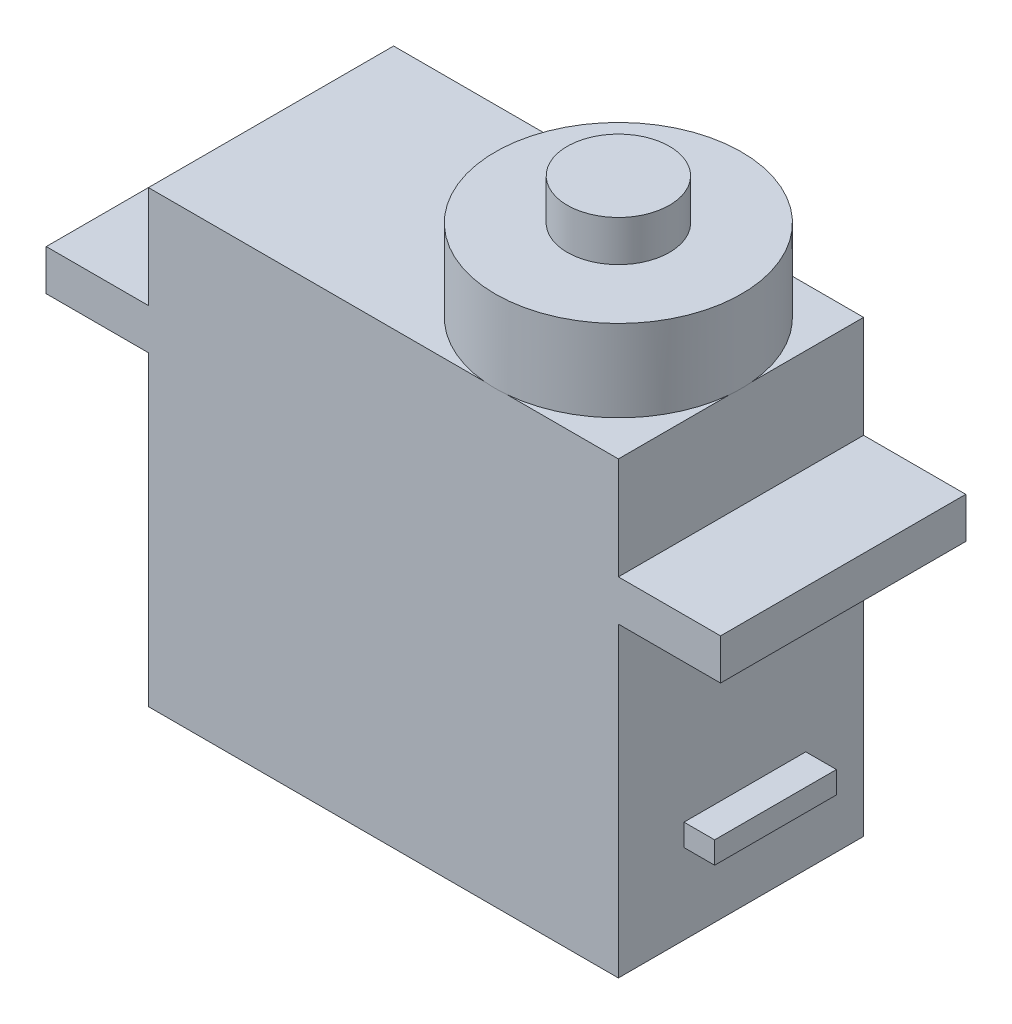
ISO-10303-21;
HEADER;
FILE_DESCRIPTION(('STEP AP214'),'2;1');
FILE_NAME('part.step','',(''),(''),'','','');
FILE_SCHEMA(('AUTOMOTIVE_DESIGN { 1 0 10303 214 1 1 1 1 }'));
ENDSEC;
DATA;
#1=APPLICATION_CONTEXT('core data for automotive mechanical design processes');
#2=APPLICATION_PROTOCOL_DEFINITION('international standard','automotive_design',2000,#1);
#3=PRODUCT_CONTEXT('',#1,'mechanical');
#4=PRODUCT('Part','Part','',(#3));
#5=PRODUCT_RELATED_PRODUCT_CATEGORY('part','',(#4));
#6=PRODUCT_DEFINITION_FORMATION('','',#4);
#7=PRODUCT_DEFINITION_CONTEXT('part definition',#1,'design');
#8=PRODUCT_DEFINITION('design','',#6,#7);
#9=PRODUCT_DEFINITION_SHAPE('','',#8);
#10=(LENGTH_UNIT() NAMED_UNIT(*) SI_UNIT(.MILLI.,.METRE.));
#11=(NAMED_UNIT(*) PLANE_ANGLE_UNIT() SI_UNIT($,.RADIAN.));
#12=(NAMED_UNIT(*) SI_UNIT($,.STERADIAN.) SOLID_ANGLE_UNIT());
#13=UNCERTAINTY_MEASURE_WITH_UNIT(LENGTH_MEASURE(1.E-05),#10,'distance_accuracy_value','');
#14=(GEOMETRIC_REPRESENTATION_CONTEXT(3) GLOBAL_UNCERTAINTY_ASSIGNED_CONTEXT((#13)) GLOBAL_UNIT_ASSIGNED_CONTEXT((#10,
#11,#12)) REPRESENTATION_CONTEXT('',''));
#15=CARTESIAN_POINT('',(0.,0.,0.));
#16=DIRECTION('',(0.,0.,1.));
#17=DIRECTION('',(1.,0.,0.));
#18=AXIS2_PLACEMENT_3D('',#15,#16,#17);
#19=CARTESIAN_POINT('',(0.,22.,0.));
#20=DIRECTION('',(0.,-1.,0.));
#21=DIRECTION('',(0.,0.,-1.));
#22=AXIS2_PLACEMENT_3D('',#19,#20,#21);
#23=PLANE('',#22);
#24=CARTESIAN_POINT('',(17.,22.,-6.));
#25=DIRECTION('',(0.,1.,0.));
#26=DIRECTION('',(0.,0.,1.));
#27=AXIS2_PLACEMENT_3D('',#24,#25,#26);
#28=CIRCLE('',#27,6.025);
#29=CARTESIAN_POINT('',(17.5482928049865,22.,0.));
#30=VERTEX_POINT('',#29);
#31=CARTESIAN_POINT('',(23.,22.,-5.45170719501344));
#32=VERTEX_POINT('',#31);
#33=EDGE_CURVE('E197',#30,#32,#28,.T.);
#34=ORIENTED_EDGE('',*,*,#33,.F.);
#35=DIRECTION('',(1.,0.,0.));
#36=VECTOR('',#35,1.);
#37=CARTESIAN_POINT('',(0.,22.,0.));
#38=LINE('',#37,#36);
#39=CARTESIAN_POINT('',(23.,22.,0.));
#40=VERTEX_POINT('',#39);
#41=EDGE_CURVE('E182',#30,#40,#38,.T.);
#42=ORIENTED_EDGE('',*,*,#41,.T.);
#43=DIRECTION('',(0.,0.,-1.));
#44=VECTOR('',#43,1.);
#45=CARTESIAN_POINT('',(23.,22.,0.));
#46=LINE('',#45,#44);
#47=EDGE_CURVE('E217',#40,#32,#46,.T.);
#48=ORIENTED_EDGE('',*,*,#47,.T.);
#49=EDGE_LOOP('',(#34,#42,#48));
#50=FACE_BOUND('',#49,.T.);
#51=ADVANCED_FACE('F39',(#50),#23,.F.);
#52=CARTESIAN_POINT('',(23.,22.,-6.54829280498656));
#53=VERTEX_POINT('',#52);
#54=CARTESIAN_POINT('',(17.5482928049865,22.,-12.));
#55=VERTEX_POINT('',#54);
#56=EDGE_CURVE('E11',#53,#55,#28,.T.);
#57=ORIENTED_EDGE('',*,*,#56,.F.);
#58=CARTESIAN_POINT('',(23.,22.,-12.));
#59=VERTEX_POINT('',#58);
#60=EDGE_CURVE('E179',#53,#59,#46,.T.);
#61=ORIENTED_EDGE('',*,*,#60,.T.);
#62=DIRECTION('',(-1.,0.,0.));
#63=VECTOR('',#62,1.);
#64=CARTESIAN_POINT('',(0.,22.,-12.));
#65=LINE('',#64,#63);
#66=EDGE_CURVE('E222',#59,#55,#65,.T.);
#67=ORIENTED_EDGE('',*,*,#66,.T.);
#68=EDGE_LOOP('',(#57,#61,#67));
#69=FACE_BOUND('',#68,.T.);
#70=ADVANCED_FACE('F303',(#69),#23,.F.);
#71=CARTESIAN_POINT('',(0.,22.,0.));
#72=DIRECTION('',(1.,0.,0.));
#73=DIRECTION('',(0.,0.,-1.));
#74=AXIS2_PLACEMENT_3D('',#71,#72,#73);
#75=PLANE('',#74);
#76=DIRECTION('',(0.,0.,-1.));
#77=VECTOR('',#76,1.);
#78=CARTESIAN_POINT('',(0.,17.,-12.));
#79=LINE('',#78,#77);
#80=CARTESIAN_POINT('',(0.,17.,0.));
#81=VERTEX_POINT('',#80);
#82=CARTESIAN_POINT('',(0.,17.,-12.));
#83=VERTEX_POINT('',#82);
#84=EDGE_CURVE('E572',#81,#83,#79,.T.);
#85=ORIENTED_EDGE('',*,*,#84,.F.);
#86=DIRECTION('',(0.,-1.,0.));
#87=VECTOR('',#86,1.);
#88=CARTESIAN_POINT('',(0.,22.,0.));
#89=LINE('',#88,#87);
#90=CARTESIAN_POINT('',(0.,22.,0.));
#91=VERTEX_POINT('',#90);
#92=EDGE_CURVE('E43',#91,#81,#89,.T.);
#93=ORIENTED_EDGE('',*,*,#92,.F.);
#94=DIRECTION('',(0.,0.,1.));
#95=VECTOR('',#94,1.);
#96=CARTESIAN_POINT('',(0.,22.,0.));
#97=LINE('',#96,#95);
#98=CARTESIAN_POINT('',(0.,22.,-12.));
#99=VERTEX_POINT('',#98);
#100=EDGE_CURVE('E175',#99,#91,#97,.T.);
#101=ORIENTED_EDGE('',*,*,#100,.F.);
#102=DIRECTION('',(0.,-1.,0.));
#103=VECTOR('',#102,1.);
#104=CARTESIAN_POINT('',(0.,22.,-12.));
#105=LINE('',#104,#103);
#106=EDGE_CURVE('E237',#99,#83,#105,.T.);
#107=ORIENTED_EDGE('',*,*,#106,.T.);
#108=EDGE_LOOP('',(#85,#93,#101,#107));
#109=FACE_BOUND('',#108,.T.);
#110=ADVANCED_FACE('F41',(#109),#75,.F.);
#111=DIRECTION('',(0.,0.,1.));
#112=VECTOR('',#111,1.);
#113=CARTESIAN_POINT('',(0.,15.,-12.));
#114=LINE('',#113,#112);
#115=CARTESIAN_POINT('',(0.,15.,-12.));
#116=VERTEX_POINT('',#115);
#117=CARTESIAN_POINT('',(0.,15.,0.));
#118=VERTEX_POINT('',#117);
#119=EDGE_CURVE('E207',#116,#118,#114,.T.);
#120=ORIENTED_EDGE('',*,*,#119,.F.);
#121=CARTESIAN_POINT('',(0.,0.,-12.));
#122=VERTEX_POINT('',#121);
#123=EDGE_CURVE('E224',#116,#122,#105,.T.);
#124=ORIENTED_EDGE('',*,*,#123,.T.);
#125=DIRECTION('',(0.,0.,1.));
#126=VECTOR('',#125,1.);
#127=CARTESIAN_POINT('',(0.,0.,0.));
#128=LINE('',#127,#126);
#129=CARTESIAN_POINT('',(0.,0.,0.));
#130=VERTEX_POINT('',#129);
#131=EDGE_CURVE('E225',#122,#130,#128,.T.);
#132=ORIENTED_EDGE('',*,*,#131,.T.);
#133=EDGE_CURVE('E201',#118,#130,#89,.T.);
#134=ORIENTED_EDGE('',*,*,#133,.F.);
#135=EDGE_LOOP('',(#120,#124,#132,#134));
#136=FACE_BOUND('',#135,.T.);
#137=ADVANCED_FACE('F300',(#136),#75,.F.);
#138=CARTESIAN_POINT('',(23.,22.,0.));
#139=DIRECTION('',(-1.,0.,0.));
#140=DIRECTION('',(0.,0.,1.));
#141=AXIS2_PLACEMENT_3D('',#138,#139,#140);
#142=PLANE('',#141);
#143=DIRECTION('',(0.,0.,-1.));
#144=VECTOR('',#143,1.);
#145=CARTESIAN_POINT('',(23.,15.,0.));
#146=LINE('',#145,#144);
#147=CARTESIAN_POINT('',(23.,15.,0.));
#148=VERTEX_POINT('',#147);
#149=CARTESIAN_POINT('',(23.,15.,-12.));
#150=VERTEX_POINT('',#149);
#151=EDGE_CURVE('E252',#148,#150,#146,.T.);
#152=ORIENTED_EDGE('',*,*,#151,.F.);
#153=DIRECTION('',(0.,-1.,0.));
#154=VECTOR('',#153,1.);
#155=CARTESIAN_POINT('',(23.,22.,0.));
#156=LINE('',#155,#154);
#157=CARTESIAN_POINT('',(23.,0.,0.));
#158=VERTEX_POINT('',#157);
#159=EDGE_CURVE('E242',#148,#158,#156,.T.);
#160=ORIENTED_EDGE('',*,*,#159,.T.);
#161=DIRECTION('',(0.,0.,-1.));
#162=VECTOR('',#161,1.);
#163=CARTESIAN_POINT('',(23.,0.,0.));
#164=LINE('',#163,#162);
#165=CARTESIAN_POINT('',(23.,0.,-12.));
#166=VERTEX_POINT('',#165);
#167=EDGE_CURVE('E231',#158,#166,#164,.T.);
#168=ORIENTED_EDGE('',*,*,#167,.T.);
#169=DIRECTION('',(0.,-1.,0.));
#170=VECTOR('',#169,1.);
#171=CARTESIAN_POINT('',(23.,22.,-12.));
#172=LINE('',#171,#170);
#173=EDGE_CURVE('E239',#150,#166,#172,.T.);
#174=ORIENTED_EDGE('',*,*,#173,.F.);
#175=EDGE_LOOP('',(#152,#160,#168,#174));
#176=FACE_BOUND('',#175,.T.);
#177=DIRECTION('',(0.,-1.,0.));
#178=VECTOR('',#177,1.);
#179=CARTESIAN_POINT('',(23.,5.,-3.21058227009722));
#180=LINE('',#179,#178);
#181=CARTESIAN_POINT('',(23.,5.,-3.21058227009722));
#182=VERTEX_POINT('',#181);
#183=CARTESIAN_POINT('',(23.,3.92368765361511,-3.21058227009722));
#184=VERTEX_POINT('',#183);
#185=EDGE_CURVE('E587',#182,#184,#180,.T.);
#186=ORIENTED_EDGE('',*,*,#185,.F.);
#187=DIRECTION('',(0.,0.,1.));
#188=VECTOR('',#187,1.);
#189=CARTESIAN_POINT('',(23.,5.,-3.21058227009722));
#190=LINE('',#189,#188);
#191=CARTESIAN_POINT('',(23.,5.,-9.17112752452106));
#192=VERTEX_POINT('',#191);
#193=EDGE_CURVE('E592',#192,#182,#190,.T.);
#194=ORIENTED_EDGE('',*,*,#193,.F.);
#195=DIRECTION('',(0.,1.,0.));
#196=VECTOR('',#195,1.);
#197=CARTESIAN_POINT('',(23.,5.,-9.17112752452106));
#198=LINE('',#197,#196);
#199=CARTESIAN_POINT('',(23.,3.92368765361511,-9.17112752452106));
#200=VERTEX_POINT('',#199);
#201=EDGE_CURVE('E604',#200,#192,#198,.T.);
#202=ORIENTED_EDGE('',*,*,#201,.F.);
#203=DIRECTION('',(0.,0.,-1.));
#204=VECTOR('',#203,1.);
#205=CARTESIAN_POINT('',(23.,3.92368765361511,-3.21058227009722));
#206=LINE('',#205,#204);
#207=EDGE_CURVE('E601',#184,#200,#206,.T.);
#208=ORIENTED_EDGE('',*,*,#207,.F.);
#209=EDGE_LOOP('',(#186,#194,#202,#208));
#210=FACE_BOUND('',#209,.T.);
#211=ADVANCED_FACE('F247',(#176,#210),#142,.F.);
#212=DIRECTION('',(0.,0.,1.));
#213=VECTOR('',#212,1.);
#214=CARTESIAN_POINT('',(23.,17.,0.));
#215=LINE('',#214,#213);
#216=CARTESIAN_POINT('',(23.,17.,-12.));
#217=VERTEX_POINT('',#216);
#218=CARTESIAN_POINT('',(23.,17.,0.));
#219=VERTEX_POINT('',#218);
#220=EDGE_CURVE('E270',#217,#219,#215,.T.);
#221=ORIENTED_EDGE('',*,*,#220,.F.);
#222=EDGE_CURVE('E240',#59,#217,#172,.T.);
#223=ORIENTED_EDGE('',*,*,#222,.F.);
#224=ORIENTED_EDGE('',*,*,#60,.F.);
#225=EDGE_CURVE('E212',#32,#53,#46,.T.);
#226=ORIENTED_EDGE('',*,*,#225,.F.);
#227=ORIENTED_EDGE('',*,*,#47,.F.);
#228=EDGE_CURVE('E243',#40,#219,#156,.T.);
#229=ORIENTED_EDGE('',*,*,#228,.T.);
#230=EDGE_LOOP('',(#221,#223,#224,#226,#227,#229));
#231=FACE_BOUND('',#230,.T.);
#232=ADVANCED_FACE('F292',(#231),#142,.F.);
#233=CARTESIAN_POINT('',(0.,22.,0.));
#234=DIRECTION('',(0.,0.,-1.));
#235=DIRECTION('',(-1.,0.,0.));
#236=AXIS2_PLACEMENT_3D('',#233,#234,#235);
#237=PLANE('',#236);
#238=DIRECTION('',(1.,0.,0.));
#239=VECTOR('',#238,1.);
#240=CARTESIAN_POINT('',(0.,0.,0.));
#241=LINE('',#240,#239);
#242=EDGE_CURVE('E228',#130,#158,#241,.T.);
#243=ORIENTED_EDGE('',*,*,#242,.T.);
#244=ORIENTED_EDGE('',*,*,#159,.F.);
#245=DIRECTION('',(-1.,0.,0.));
#246=VECTOR('',#245,1.);
#247=CARTESIAN_POINT('',(28.,15.,0.));
#248=LINE('',#247,#246);
#249=CARTESIAN_POINT('',(28.,15.,0.));
#250=VERTEX_POINT('',#249);
#251=EDGE_CURVE('E229',#250,#148,#248,.T.);
#252=ORIENTED_EDGE('',*,*,#251,.F.);
#253=DIRECTION('',(0.,-1.,0.));
#254=VECTOR('',#253,1.);
#255=CARTESIAN_POINT('',(28.,17.,0.));
#256=LINE('',#255,#254);
#257=CARTESIAN_POINT('',(28.,17.,0.));
#258=VERTEX_POINT('',#257);
#259=EDGE_CURVE('E273',#258,#250,#256,.T.);
#260=ORIENTED_EDGE('',*,*,#259,.F.);
#261=DIRECTION('',(-1.,0.,0.));
#262=VECTOR('',#261,1.);
#263=CARTESIAN_POINT('',(28.,17.,0.));
#264=LINE('',#263,#262);
#265=EDGE_CURVE('E282',#258,#219,#264,.T.);
#266=ORIENTED_EDGE('',*,*,#265,.T.);
#267=ORIENTED_EDGE('',*,*,#228,.F.);
#268=ORIENTED_EDGE('',*,*,#41,.F.);
#269=CARTESIAN_POINT('',(16.4517071950135,22.,0.));
#270=VERTEX_POINT('',#269);
#271=EDGE_CURVE('E180',#270,#30,#38,.T.);
#272=ORIENTED_EDGE('',*,*,#271,.F.);
#273=EDGE_CURVE('E171',#91,#270,#38,.T.);
#274=ORIENTED_EDGE('',*,*,#273,.F.);
#275=ORIENTED_EDGE('',*,*,#92,.T.);
#276=DIRECTION('',(1.,0.,0.));
#277=VECTOR('',#276,1.);
#278=CARTESIAN_POINT('',(-5.,17.,0.));
#279=LINE('',#278,#277);
#280=CARTESIAN_POINT('',(-5.,17.,0.));
#281=VERTEX_POINT('',#280);
#282=EDGE_CURVE('E576',#281,#81,#279,.T.);
#283=ORIENTED_EDGE('',*,*,#282,.F.);
#284=DIRECTION('',(0.,1.,0.));
#285=VECTOR('',#284,1.);
#286=CARTESIAN_POINT('',(-5.,17.,0.));
#287=LINE('',#286,#285);
#288=CARTESIAN_POINT('',(-5.,15.,0.));
#289=VERTEX_POINT('',#288);
#290=EDGE_CURVE('E634',#289,#281,#287,.T.);
#291=ORIENTED_EDGE('',*,*,#290,.F.);
#292=DIRECTION('',(1.,0.,0.));
#293=VECTOR('',#292,1.);
#294=CARTESIAN_POINT('',(-5.,15.,0.));
#295=LINE('',#294,#293);
#296=EDGE_CURVE('E579',#289,#118,#295,.T.);
#297=ORIENTED_EDGE('',*,*,#296,.T.);
#298=ORIENTED_EDGE('',*,*,#133,.T.);
#299=EDGE_LOOP('',(#243,#244,#252,#260,#266,#267,#268,#272,#274,#275,#283,#291,#297,#298));
#300=FACE_BOUND('',#299,.T.);
#301=ADVANCED_FACE('F187',(#300),#237,.F.);
#302=CARTESIAN_POINT('',(0.,22.,-12.));
#303=DIRECTION('',(0.,0.,1.));
#304=DIRECTION('',(1.,0.,0.));
#305=AXIS2_PLACEMENT_3D('',#302,#303,#304);
#306=PLANE('',#305);
#307=DIRECTION('',(-1.,0.,0.));
#308=VECTOR('',#307,1.);
#309=CARTESIAN_POINT('',(0.,0.,-12.));
#310=LINE('',#309,#308);
#311=EDGE_CURVE('E234',#166,#122,#310,.T.);
#312=ORIENTED_EDGE('',*,*,#311,.T.);
#313=ORIENTED_EDGE('',*,*,#123,.F.);
#314=DIRECTION('',(1.,0.,0.));
#315=VECTOR('',#314,1.);
#316=CARTESIAN_POINT('',(-5.,15.,-12.));
#317=LINE('',#316,#315);
#318=CARTESIAN_POINT('',(-5.,15.,-12.));
#319=VERTEX_POINT('',#318);
#320=EDGE_CURVE('E581',#319,#116,#317,.T.);
#321=ORIENTED_EDGE('',*,*,#320,.F.);
#322=DIRECTION('',(0.,-1.,0.));
#323=VECTOR('',#322,1.);
#324=CARTESIAN_POINT('',(-5.,17.,-12.));
#325=LINE('',#324,#323);
#326=CARTESIAN_POINT('',(-5.,17.,-12.));
#327=VERTEX_POINT('',#326);
#328=EDGE_CURVE('E633',#327,#319,#325,.T.);
#329=ORIENTED_EDGE('',*,*,#328,.F.);
#330=DIRECTION('',(1.,0.,0.));
#331=VECTOR('',#330,1.);
#332=CARTESIAN_POINT('',(-5.,17.,-12.));
#333=LINE('',#332,#331);
#334=EDGE_CURVE('E570',#327,#83,#333,.T.);
#335=ORIENTED_EDGE('',*,*,#334,.T.);
#336=ORIENTED_EDGE('',*,*,#106,.F.);
#337=CARTESIAN_POINT('',(16.4517071950135,22.,-12.));
#338=VERTEX_POINT('',#337);
#339=EDGE_CURVE('E219',#338,#99,#65,.T.);
#340=ORIENTED_EDGE('',*,*,#339,.F.);
#341=EDGE_CURVE('E63',#55,#338,#65,.T.);
#342=ORIENTED_EDGE('',*,*,#341,.F.);
#343=ORIENTED_EDGE('',*,*,#66,.F.);
#344=ORIENTED_EDGE('',*,*,#222,.T.);
#345=DIRECTION('',(-1.,0.,0.));
#346=VECTOR('',#345,1.);
#347=CARTESIAN_POINT('',(28.,17.,-12.));
#348=LINE('',#347,#346);
#349=CARTESIAN_POINT('',(28.,17.,-12.));
#350=VERTEX_POINT('',#349);
#351=EDGE_CURVE('E285',#350,#217,#348,.T.);
#352=ORIENTED_EDGE('',*,*,#351,.F.);
#353=DIRECTION('',(0.,1.,0.));
#354=VECTOR('',#353,1.);
#355=CARTESIAN_POINT('',(28.,17.,-12.));
#356=LINE('',#355,#354);
#357=CARTESIAN_POINT('',(28.,15.,-12.));
#358=VERTEX_POINT('',#357);
#359=EDGE_CURVE('E619',#358,#350,#356,.T.);
#360=ORIENTED_EDGE('',*,*,#359,.F.);
#361=DIRECTION('',(-1.,0.,0.));
#362=VECTOR('',#361,1.);
#363=CARTESIAN_POINT('',(28.,15.,-12.));
#364=LINE('',#363,#362);
#365=EDGE_CURVE('E267',#358,#150,#364,.T.);
#366=ORIENTED_EDGE('',*,*,#365,.T.);
#367=ORIENTED_EDGE('',*,*,#173,.T.);
#368=EDGE_LOOP('',(#312,#313,#321,#329,#335,#336,#340,#342,#343,#344,#352,#360,#366,#367));
#369=FACE_BOUND('',#368,.T.);
#370=ADVANCED_FACE('F261',(#369),#306,.F.);
#371=EDGE_CURVE('E48',#338,#270,#28,.T.);
#372=ORIENTED_EDGE('',*,*,#371,.F.);
#373=ORIENTED_EDGE('',*,*,#339,.T.);
#374=ORIENTED_EDGE('',*,*,#100,.T.);
#375=ORIENTED_EDGE('',*,*,#273,.T.);
#376=EDGE_LOOP('',(#372,#373,#374,#375));
#377=FACE_BOUND('',#376,.T.);
#378=ADVANCED_FACE('F173',(#377),#23,.F.);
#379=CARTESIAN_POINT('',(0.,0.,0.));
#380=DIRECTION('',(0.,-1.,0.));
#381=DIRECTION('',(0.,0.,-1.));
#382=AXIS2_PLACEMENT_3D('',#379,#380,#381);
#383=PLANE('',#382);
#384=ORIENTED_EDGE('',*,*,#131,.F.);
#385=ORIENTED_EDGE('',*,*,#311,.F.);
#386=ORIENTED_EDGE('',*,*,#167,.F.);
#387=ORIENTED_EDGE('',*,*,#242,.F.);
#388=EDGE_LOOP('',(#384,#385,#386,#387));
#389=FACE_BOUND('',#388,.T.);
#390=ADVANCED_FACE('F259',(#389),#383,.T.);
#391=CARTESIAN_POINT('',(28.,15.,0.));
#392=DIRECTION('',(0.,1.,0.));
#393=DIRECTION('',(0.,0.,1.));
#394=AXIS2_PLACEMENT_3D('',#391,#392,#393);
#395=PLANE('',#394);
#396=ORIENTED_EDGE('',*,*,#151,.T.);
#397=ORIENTED_EDGE('',*,*,#365,.F.);
#398=DIRECTION('',(0.,0.,-1.));
#399=VECTOR('',#398,1.);
#400=CARTESIAN_POINT('',(28.,15.,0.));
#401=LINE('',#400,#399);
#402=EDGE_CURVE('E618',#250,#358,#401,.T.);
#403=ORIENTED_EDGE('',*,*,#402,.F.);
#404=ORIENTED_EDGE('',*,*,#251,.T.);
#405=EDGE_LOOP('',(#396,#397,#403,#404));
#406=FACE_BOUND('',#405,.T.);
#407=ADVANCED_FACE('F269',(#406),#395,.F.);
#408=CARTESIAN_POINT('',(28.,17.,0.));
#409=DIRECTION('',(0.,-1.,0.));
#410=DIRECTION('',(0.,0.,-1.));
#411=AXIS2_PLACEMENT_3D('',#408,#409,#410);
#412=PLANE('',#411);
#413=ORIENTED_EDGE('',*,*,#220,.T.);
#414=ORIENTED_EDGE('',*,*,#265,.F.);
#415=DIRECTION('',(0.,0.,1.));
#416=VECTOR('',#415,1.);
#417=CARTESIAN_POINT('',(28.,17.,0.));
#418=LINE('',#417,#416);
#419=EDGE_CURVE('E279',#350,#258,#418,.T.);
#420=ORIENTED_EDGE('',*,*,#419,.F.);
#421=ORIENTED_EDGE('',*,*,#351,.T.);
#422=EDGE_LOOP('',(#413,#414,#420,#421));
#423=FACE_BOUND('',#422,.T.);
#424=ADVANCED_FACE('F452',(#423),#412,.F.);
#425=CARTESIAN_POINT('',(28.,0.,0.));
#426=DIRECTION('',(1.,0.,0.));
#427=DIRECTION('',(0.,0.,-1.));
#428=AXIS2_PLACEMENT_3D('',#425,#426,#427);
#429=PLANE('',#428);
#430=ORIENTED_EDGE('',*,*,#259,.T.);
#431=ORIENTED_EDGE('',*,*,#402,.T.);
#432=ORIENTED_EDGE('',*,*,#359,.T.);
#433=ORIENTED_EDGE('',*,*,#419,.T.);
#434=EDGE_LOOP('',(#430,#431,#432,#433));
#435=FACE_BOUND('',#434,.T.);
#436=ADVANCED_FACE('F436',(#435),#429,.T.);
#437=CARTESIAN_POINT('',(24.5,5.,-3.21058227009722));
#438=DIRECTION('',(0.,0.,-1.));
#439=DIRECTION('',(-1.,0.,0.));
#440=AXIS2_PLACEMENT_3D('',#437,#438,#439);
#441=PLANE('',#440);
#442=ORIENTED_EDGE('',*,*,#185,.T.);
#443=DIRECTION('',(-1.,0.,0.));
#444=VECTOR('',#443,1.);
#445=CARTESIAN_POINT('',(24.5,3.92368765361511,-3.21058227009722));
#446=LINE('',#445,#444);
#447=CARTESIAN_POINT('',(24.5,3.92368765361511,-3.21058227009722));
#448=VERTEX_POINT('',#447);
#449=EDGE_CURVE('E271',#448,#184,#446,.T.);
#450=ORIENTED_EDGE('',*,*,#449,.F.);
#451=DIRECTION('',(0.,-1.,0.));
#452=VECTOR('',#451,1.);
#453=CARTESIAN_POINT('',(24.5,5.,-3.21058227009722));
#454=LINE('',#453,#452);
#455=CARTESIAN_POINT('',(24.5,5.,-3.21058227009722));
#456=VERTEX_POINT('',#455);
#457=EDGE_CURVE('E588',#456,#448,#454,.T.);
#458=ORIENTED_EDGE('',*,*,#457,.F.);
#459=DIRECTION('',(-1.,0.,0.));
#460=VECTOR('',#459,1.);
#461=CARTESIAN_POINT('',(24.5,5.,-3.21058227009722));
#462=LINE('',#461,#460);
#463=EDGE_CURVE('E598',#456,#182,#462,.T.);
#464=ORIENTED_EDGE('',*,*,#463,.T.);
#465=EDGE_LOOP('',(#442,#450,#458,#464));
#466=FACE_BOUND('',#465,.T.);
#467=ADVANCED_FACE('F426',(#466),#441,.F.);
#468=CARTESIAN_POINT('',(24.5,3.92368765361511,-3.21058227009722));
#469=DIRECTION('',(0.,1.,0.));
#470=DIRECTION('',(0.,0.,1.));
#471=AXIS2_PLACEMENT_3D('',#468,#469,#470);
#472=PLANE('',#471);
#473=ORIENTED_EDGE('',*,*,#207,.T.);
#474=DIRECTION('',(-1.,0.,0.));
#475=VECTOR('',#474,1.);
#476=CARTESIAN_POINT('',(24.5,3.92368765361511,-9.17112752452106));
#477=LINE('',#476,#475);
#478=CARTESIAN_POINT('',(24.5,3.92368765361511,-9.17112752452106));
#479=VERTEX_POINT('',#478);
#480=EDGE_CURVE('E276',#479,#200,#477,.T.);
#481=ORIENTED_EDGE('',*,*,#480,.F.);
#482=DIRECTION('',(0.,0.,-1.));
#483=VECTOR('',#482,1.);
#484=CARTESIAN_POINT('',(24.5,3.92368765361511,-3.21058227009722));
#485=LINE('',#484,#483);
#486=EDGE_CURVE('E591',#448,#479,#485,.T.);
#487=ORIENTED_EDGE('',*,*,#486,.F.);
#488=ORIENTED_EDGE('',*,*,#449,.T.);
#489=EDGE_LOOP('',(#473,#481,#487,#488));
#490=FACE_BOUND('',#489,.T.);
#491=ADVANCED_FACE('F416',(#490),#472,.F.);
#492=CARTESIAN_POINT('',(24.5,5.,-9.17112752452106));
#493=DIRECTION('',(0.,0.,1.));
#494=DIRECTION('',(1.,0.,0.));
#495=AXIS2_PLACEMENT_3D('',#492,#493,#494);
#496=PLANE('',#495);
#497=ORIENTED_EDGE('',*,*,#201,.T.);
#498=DIRECTION('',(-1.,0.,0.));
#499=VECTOR('',#498,1.);
#500=CARTESIAN_POINT('',(24.5,5.,-9.17112752452106));
#501=LINE('',#500,#499);
#502=CARTESIAN_POINT('',(24.5,5.,-9.17112752452106));
#503=VERTEX_POINT('',#502);
#504=EDGE_CURVE('E611',#503,#192,#501,.T.);
#505=ORIENTED_EDGE('',*,*,#504,.F.);
#506=DIRECTION('',(0.,1.,0.));
#507=VECTOR('',#506,1.);
#508=CARTESIAN_POINT('',(24.5,5.,-9.17112752452106));
#509=LINE('',#508,#507);
#510=EDGE_CURVE('E594',#479,#503,#509,.T.);
#511=ORIENTED_EDGE('',*,*,#510,.F.);
#512=ORIENTED_EDGE('',*,*,#480,.T.);
#513=EDGE_LOOP('',(#497,#505,#511,#512));
#514=FACE_BOUND('',#513,.T.);
#515=ADVANCED_FACE('F406',(#514),#496,.F.);
#516=CARTESIAN_POINT('',(24.5,5.,-3.21058227009722));
#517=DIRECTION('',(0.,-1.,0.));
#518=DIRECTION('',(0.,0.,-1.));
#519=AXIS2_PLACEMENT_3D('',#516,#517,#518);
#520=PLANE('',#519);
#521=ORIENTED_EDGE('',*,*,#193,.T.);
#522=ORIENTED_EDGE('',*,*,#463,.F.);
#523=DIRECTION('',(0.,0.,1.));
#524=VECTOR('',#523,1.);
#525=CARTESIAN_POINT('',(24.5,5.,-3.21058227009722));
#526=LINE('',#525,#524);
#527=EDGE_CURVE('E596',#503,#456,#526,.T.);
#528=ORIENTED_EDGE('',*,*,#527,.F.);
#529=ORIENTED_EDGE('',*,*,#504,.T.);
#530=EDGE_LOOP('',(#521,#522,#528,#529));
#531=FACE_BOUND('',#530,.T.);
#532=ADVANCED_FACE('F396',(#531),#520,.F.);
#533=CARTESIAN_POINT('',(24.5,0.,0.));
#534=DIRECTION('',(1.,0.,0.));
#535=DIRECTION('',(0.,0.,-1.));
#536=AXIS2_PLACEMENT_3D('',#533,#534,#535);
#537=PLANE('',#536);
#538=ORIENTED_EDGE('',*,*,#457,.T.);
#539=ORIENTED_EDGE('',*,*,#486,.T.);
#540=ORIENTED_EDGE('',*,*,#510,.T.);
#541=ORIENTED_EDGE('',*,*,#527,.T.);
#542=EDGE_LOOP('',(#538,#539,#540,#541));
#543=FACE_BOUND('',#542,.T.);
#544=ADVANCED_FACE('F372',(#543),#537,.T.);
#545=CARTESIAN_POINT('',(-5.,15.,-12.));
#546=DIRECTION('',(0.,1.,0.));
#547=DIRECTION('',(0.,0.,1.));
#548=AXIS2_PLACEMENT_3D('',#545,#546,#547);
#549=PLANE('',#548);
#550=ORIENTED_EDGE('',*,*,#119,.T.);
#551=ORIENTED_EDGE('',*,*,#296,.F.);
#552=DIRECTION('',(0.,0.,1.));
#553=VECTOR('',#552,1.);
#554=CARTESIAN_POINT('',(-5.,15.,-12.));
#555=LINE('',#554,#553);
#556=EDGE_CURVE('E631',#319,#289,#555,.T.);
#557=ORIENTED_EDGE('',*,*,#556,.F.);
#558=ORIENTED_EDGE('',*,*,#320,.T.);
#559=EDGE_LOOP('',(#550,#551,#557,#558));
#560=FACE_BOUND('',#559,.T.);
#561=ADVANCED_FACE('F362',(#560),#549,.F.);
#562=CARTESIAN_POINT('',(-5.,17.,-12.));
#563=DIRECTION('',(0.,-1.,0.));
#564=DIRECTION('',(0.,0.,-1.));
#565=AXIS2_PLACEMENT_3D('',#562,#563,#564);
#566=PLANE('',#565);
#567=ORIENTED_EDGE('',*,*,#84,.T.);
#568=ORIENTED_EDGE('',*,*,#334,.F.);
#569=DIRECTION('',(0.,0.,-1.));
#570=VECTOR('',#569,1.);
#571=CARTESIAN_POINT('',(-5.,17.,-12.));
#572=LINE('',#571,#570);
#573=EDGE_CURVE('E578',#281,#327,#572,.T.);
#574=ORIENTED_EDGE('',*,*,#573,.F.);
#575=ORIENTED_EDGE('',*,*,#282,.T.);
#576=EDGE_LOOP('',(#567,#568,#574,#575));
#577=FACE_BOUND('',#576,.T.);
#578=ADVANCED_FACE('F351',(#577),#566,.F.);
#579=CARTESIAN_POINT('',(-5.,0.,0.));
#580=DIRECTION('',(-1.,0.,0.));
#581=DIRECTION('',(0.,0.,1.));
#582=AXIS2_PLACEMENT_3D('',#579,#580,#581);
#583=PLANE('',#582);
#584=ORIENTED_EDGE('',*,*,#328,.T.);
#585=ORIENTED_EDGE('',*,*,#556,.T.);
#586=ORIENTED_EDGE('',*,*,#290,.T.);
#587=ORIENTED_EDGE('',*,*,#573,.T.);
#588=EDGE_LOOP('',(#584,#585,#586,#587));
#589=FACE_BOUND('',#588,.T.);
#590=ADVANCED_FACE('F347',(#589),#583,.T.);
#591=CARTESIAN_POINT('',(17.,22.,-6.));
#592=DIRECTION('',(0.,1.,0.));
#593=DIRECTION('',(0.,0.,1.));
#594=AXIS2_PLACEMENT_3D('',#591,#592,#593);
#595=PLANE('',#594);
#596=EDGE_CURVE('E191',#270,#30,#28,.T.);
#597=ORIENTED_EDGE('',*,*,#596,.F.);
#598=ORIENTED_EDGE('',*,*,#271,.T.);
#599=EDGE_LOOP('',(#597,#598));
#600=FACE_BOUND('',#599,.T.);
#601=ADVANCED_FACE('F192',(#600),#595,.F.);
#602=EDGE_CURVE('E50',#32,#53,#28,.T.);
#603=ORIENTED_EDGE('',*,*,#602,.F.);
#604=ORIENTED_EDGE('',*,*,#225,.T.);
#605=EDGE_LOOP('',(#603,#604));
#606=FACE_BOUND('',#605,.T.);
#607=ADVANCED_FACE('F211',(#606),#595,.F.);
#608=EDGE_CURVE('E195',#55,#338,#28,.T.);
#609=ORIENTED_EDGE('',*,*,#608,.F.);
#610=ORIENTED_EDGE('',*,*,#341,.T.);
#611=EDGE_LOOP('',(#609,#610));
#612=FACE_BOUND('',#611,.T.);
#613=ADVANCED_FACE('F499',(#612),#595,.F.);
#614=CARTESIAN_POINT('',(17.,26.,-6.));
#615=DIRECTION('',(0.,-1.,0.));
#616=DIRECTION('',(0.,0.,-1.));
#617=AXIS2_PLACEMENT_3D('',#614,#615,#616);
#618=CYLINDRICAL_SURFACE('',#617,6.025);
#619=CARTESIAN_POINT('',(17.,26.,-6.));
#620=DIRECTION('',(0.,1.,0.));
#621=DIRECTION('',(0.,0.,1.));
#622=AXIS2_PLACEMENT_3D('',#619,#620,#621);
#623=CIRCLE('',#622,6.025);
#624=CARTESIAN_POINT('',(17.,26.,0.0250000000000016));
#625=VERTEX_POINT('',#624);
#626=EDGE_CURVE('E204',#625,#625,#623,.T.);
#627=ORIENTED_EDGE('',*,*,#626,.F.);
#628=EDGE_LOOP('',(#627));
#629=FACE_BOUND('',#628,.T.);
#630=ORIENTED_EDGE('',*,*,#33,.T.);
#631=ORIENTED_EDGE('',*,*,#602,.T.);
#632=ORIENTED_EDGE('',*,*,#56,.T.);
#633=ORIENTED_EDGE('',*,*,#608,.T.);
#634=ORIENTED_EDGE('',*,*,#371,.T.);
#635=ORIENTED_EDGE('',*,*,#596,.T.);
#636=EDGE_LOOP('',(#630,#631,#632,#633,#634,#635));
#637=FACE_BOUND('',#636,.T.);
#638=ADVANCED_FACE('F199',(#629,#637),#618,.T.);
#639=CARTESIAN_POINT('',(17.,26.,-6.));
#640=DIRECTION('',(0.,1.,0.));
#641=DIRECTION('',(0.,0.,1.));
#642=AXIS2_PLACEMENT_3D('',#639,#640,#641);
#643=PLANE('',#642);
#644=CARTESIAN_POINT('',(17.,26.,-6.));
#645=DIRECTION('',(0.,1.,0.));
#646=DIRECTION('',(0.,0.,1.));
#647=AXIS2_PLACEMENT_3D('',#644,#645,#646);
#648=CIRCLE('',#647,2.5);
#649=CARTESIAN_POINT('',(17.,26.,-3.5));
#650=VERTEX_POINT('',#649);
#651=EDGE_CURVE('E558',#650,#650,#648,.T.);
#652=ORIENTED_EDGE('',*,*,#651,.F.);
#653=EDGE_LOOP('',(#652));
#654=FACE_BOUND('',#653,.T.);
#655=ORIENTED_EDGE('',*,*,#626,.T.);
#656=EDGE_LOOP('',(#655));
#657=FACE_BOUND('',#656,.T.);
#658=ADVANCED_FACE('F522',(#654,#657),#643,.T.);
#659=CARTESIAN_POINT('',(17.,28.,-6.));
#660=DIRECTION('',(0.,-1.,0.));
#661=DIRECTION('',(0.,0.,-1.));
#662=AXIS2_PLACEMENT_3D('',#659,#660,#661);
#663=CYLINDRICAL_SURFACE('',#662,2.5);
#664=CARTESIAN_POINT('',(17.,28.,-6.));
#665=DIRECTION('',(0.,1.,0.));
#666=DIRECTION('',(0.,0.,1.));
#667=AXIS2_PLACEMENT_3D('',#664,#665,#666);
#668=CIRCLE('',#667,2.5);
#669=CARTESIAN_POINT('',(17.,28.,-3.5));
#670=VERTEX_POINT('',#669);
#671=EDGE_CURVE('E196',#670,#670,#668,.T.);
#672=ORIENTED_EDGE('',*,*,#671,.F.);
#673=EDGE_LOOP('',(#672));
#674=FACE_BOUND('',#673,.T.);
#675=ORIENTED_EDGE('',*,*,#651,.T.);
#676=EDGE_LOOP('',(#675));
#677=FACE_BOUND('',#676,.T.);
#678=ADVANCED_FACE('F532',(#674,#677),#663,.T.);
#679=CARTESIAN_POINT('',(17.,28.,-6.));
#680=DIRECTION('',(0.,1.,0.));
#681=DIRECTION('',(0.,0.,1.));
#682=AXIS2_PLACEMENT_3D('',#679,#680,#681);
#683=PLANE('',#682);
#684=ORIENTED_EDGE('',*,*,#671,.T.);
#685=EDGE_LOOP('',(#684));
#686=FACE_BOUND('',#685,.T.);
#687=ADVANCED_FACE('F542',(#686),#683,.T.);
#688=CLOSED_SHELL('',(#51,#70,#110,#137,#211,#232,#301,#370,#378,#390,#407,#424,#436,#467,#491,
#515,#532,#544,#561,#578,#590,#601,#607,#613,#638,#658,#678,#687));
#689=MANIFOLD_SOLID_BREP('B2',#688);
#690=ADVANCED_BREP_SHAPE_REPRESENTATION('',(#18,#689),#14);
#691=SHAPE_DEFINITION_REPRESENTATION(#9,#690);
ENDSEC;
END-ISO-10303-21;
